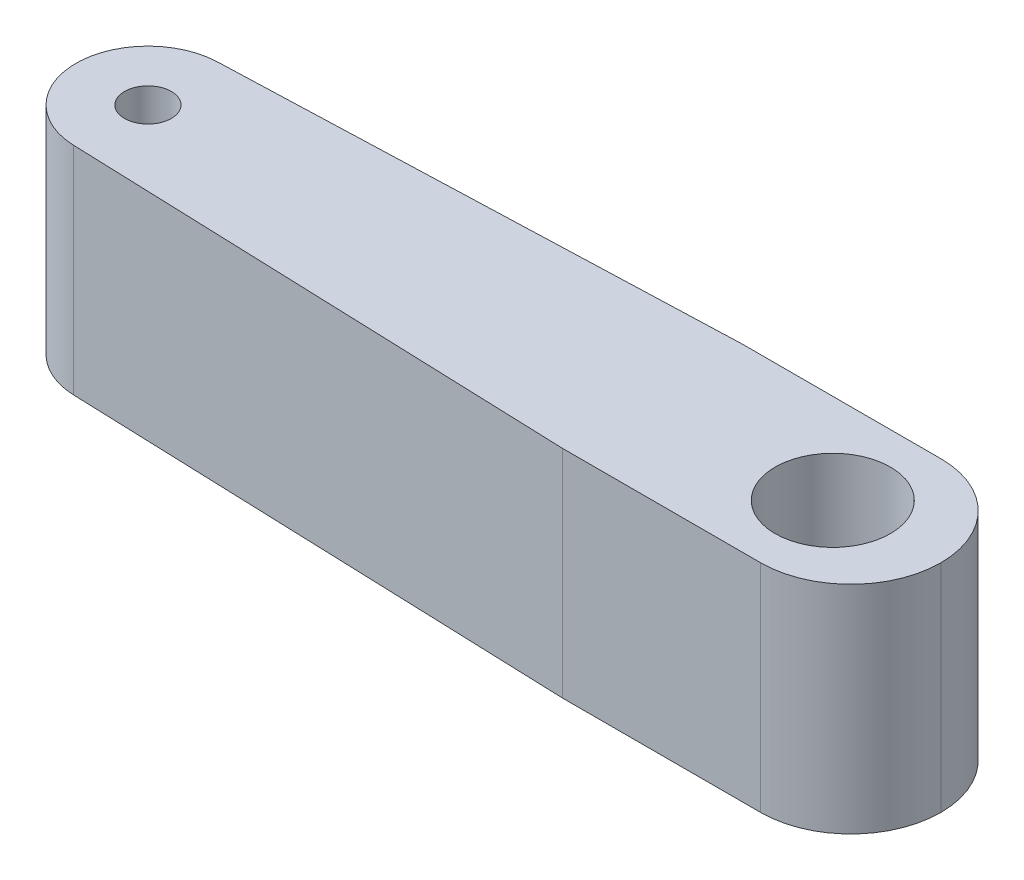
ISO-10303-21;
HEADER;
FILE_DESCRIPTION(('STEP AP214'),'2;1');
FILE_NAME('part.step','',(''),(''),'','','');
FILE_SCHEMA(('AUTOMOTIVE_DESIGN { 1 0 10303 214 1 1 1 1 }'));
ENDSEC;
DATA;
#1=APPLICATION_CONTEXT('core data for automotive mechanical design processes');
#2=APPLICATION_PROTOCOL_DEFINITION('international standard','automotive_design',2000,#1);
#3=PRODUCT_CONTEXT('',#1,'mechanical');
#4=PRODUCT('Part','Part','',(#3));
#5=PRODUCT_RELATED_PRODUCT_CATEGORY('part','',(#4));
#6=PRODUCT_DEFINITION_FORMATION('','',#4);
#7=PRODUCT_DEFINITION_CONTEXT('part definition',#1,'design');
#8=PRODUCT_DEFINITION('design','',#6,#7);
#9=PRODUCT_DEFINITION_SHAPE('','',#8);
#10=(LENGTH_UNIT() NAMED_UNIT(*) SI_UNIT(.MILLI.,.METRE.));
#11=(NAMED_UNIT(*) PLANE_ANGLE_UNIT() SI_UNIT($,.RADIAN.));
#12=(NAMED_UNIT(*) SI_UNIT($,.STERADIAN.) SOLID_ANGLE_UNIT());
#13=UNCERTAINTY_MEASURE_WITH_UNIT(LENGTH_MEASURE(1.E-05),#10,'distance_accuracy_value','');
#14=(GEOMETRIC_REPRESENTATION_CONTEXT(3) GLOBAL_UNCERTAINTY_ASSIGNED_CONTEXT((#13)) GLOBAL_UNIT_ASSIGNED_CONTEXT((#10,
#11,#12)) REPRESENTATION_CONTEXT('',''));
#15=CARTESIAN_POINT('',(0.,0.,0.));
#16=DIRECTION('',(0.,0.,1.));
#17=DIRECTION('',(1.,0.,0.));
#18=AXIS2_PLACEMENT_3D('',#15,#16,#17);
#19=CARTESIAN_POINT('',(-12.5,6.,-2.5));
#20=DIRECTION('',(0.,0.,1.));
#21=DIRECTION('',(1.,0.,0.));
#22=AXIS2_PLACEMENT_3D('',#19,#20,#21);
#23=PLANE('',#22);
#24=DIRECTION('',(0.,1.,0.));
#25=VECTOR('',#24,1.);
#26=CARTESIAN_POINT('',(4.5,-1.,-2.5));
#27=LINE('',#26,#25);
#28=CARTESIAN_POINT('',(4.49999999999763,0.,-2.49999999999996));
#29=VERTEX_POINT('',#28);
#30=CARTESIAN_POINT('',(4.5,6.,-2.5));
#31=VERTEX_POINT('',#30);
#32=EDGE_CURVE('E54',#29,#31,#27,.T.);
#33=ORIENTED_EDGE('',*,*,#32,.T.);
#34=DIRECTION('',(-1.,0.,0.));
#35=VECTOR('',#34,1.);
#36=CARTESIAN_POINT('',(-12.5,6.,-2.5));
#37=LINE('',#36,#35);
#38=CARTESIAN_POINT('',(10.,6.,-2.5));
#39=VERTEX_POINT('',#38);
#40=EDGE_CURVE('E117',#39,#31,#37,.T.);
#41=ORIENTED_EDGE('',*,*,#40,.F.);
#42=DIRECTION('',(0.,-1.,0.));
#43=VECTOR('',#42,1.);
#44=CARTESIAN_POINT('',(10.,6.,-2.5));
#45=LINE('',#44,#43);
#46=CARTESIAN_POINT('',(10.,0.,-2.5));
#47=VERTEX_POINT('',#46);
#48=EDGE_CURVE('E157',#39,#47,#45,.T.);
#49=ORIENTED_EDGE('',*,*,#48,.T.);
#50=DIRECTION('',(-1.,0.,0.));
#51=VECTOR('',#50,1.);
#52=CARTESIAN_POINT('',(-12.5,0.,-2.5));
#53=LINE('',#52,#51);
#54=EDGE_CURVE('E138',#47,#29,#53,.T.);
#55=ORIENTED_EDGE('',*,*,#54,.T.);
#56=EDGE_LOOP('',(#33,#41,#49,#55));
#57=FACE_BOUND('',#56,.T.);
#58=ADVANCED_FACE('F39',(#57),#23,.F.);
#59=CARTESIAN_POINT('',(-12.5,6.,2.5));
#60=DIRECTION('',(0.,0.,-1.));
#61=DIRECTION('',(-1.,0.,0.));
#62=AXIS2_PLACEMENT_3D('',#59,#60,#61);
#63=PLANE('',#62);
#64=DIRECTION('',(1.,0.,0.));
#65=VECTOR('',#64,1.);
#66=CARTESIAN_POINT('',(-12.5,6.,2.5));
#67=LINE('',#66,#65);
#68=CARTESIAN_POINT('',(4.5,6.,2.5));
#69=VERTEX_POINT('',#68);
#70=CARTESIAN_POINT('',(10.,6.,2.5));
#71=VERTEX_POINT('',#70);
#72=EDGE_CURVE('E134',#69,#71,#67,.T.);
#73=ORIENTED_EDGE('',*,*,#72,.F.);
#74=DIRECTION('',(0.,1.,0.));
#75=VECTOR('',#74,1.);
#76=CARTESIAN_POINT('',(4.5,-1.,2.5));
#77=LINE('',#76,#75);
#78=CARTESIAN_POINT('',(4.5,0.,2.5));
#79=VERTEX_POINT('',#78);
#80=EDGE_CURVE('E123',#79,#69,#77,.T.);
#81=ORIENTED_EDGE('',*,*,#80,.F.);
#82=DIRECTION('',(1.,0.,0.));
#83=VECTOR('',#82,1.);
#84=CARTESIAN_POINT('',(-12.5,0.,2.5));
#85=LINE('',#84,#83);
#86=CARTESIAN_POINT('',(10.,0.,2.5));
#87=VERTEX_POINT('',#86);
#88=EDGE_CURVE('E135',#79,#87,#85,.T.);
#89=ORIENTED_EDGE('',*,*,#88,.T.);
#90=DIRECTION('',(0.,-1.,0.));
#91=VECTOR('',#90,1.);
#92=CARTESIAN_POINT('',(10.,6.,2.5));
#93=LINE('',#92,#91);
#94=EDGE_CURVE('E151',#87,#71,#93,.F.);
#95=ORIENTED_EDGE('',*,*,#94,.T.);
#96=EDGE_LOOP('',(#73,#81,#89,#95));
#97=FACE_BOUND('',#96,.T.);
#98=ADVANCED_FACE('F171',(#97),#63,.F.);
#99=CARTESIAN_POINT('',(0.,6.,0.));
#100=DIRECTION('',(0.,1.,0.));
#101=DIRECTION('',(0.,0.,1.));
#102=AXIS2_PLACEMENT_3D('',#99,#100,#101);
#103=PLANE('',#102);
#104=DIRECTION('',(-0.999366080418273,0.,-0.0356010857898856));
#105=VECTOR('',#104,1.);
#106=CARTESIAN_POINT('',(-0.083242826018797,6.,2.33672807768633));
#107=LINE('',#106,#105);
#108=CARTESIAN_POINT('',(-9.57120217157932,6.,1.99873216082384));
#109=VERTEX_POINT('',#108);
#110=EDGE_CURVE('E105',#69,#109,#107,.T.);
#111=ORIENTED_EDGE('',*,*,#110,.F.);
#112=ORIENTED_EDGE('',*,*,#72,.T.);
#113=CARTESIAN_POINT('',(10.,6.,0.));
#114=DIRECTION('',(0.,1.,0.));
#115=DIRECTION('',(0.,0.,1.));
#116=AXIS2_PLACEMENT_3D('',#113,#114,#115);
#117=CIRCLE('',#116,2.5);
#118=CARTESIAN_POINT('',(12.5,6.,0.));
#119=VERTEX_POINT('',#118);
#120=EDGE_CURVE('E155',#71,#119,#117,.T.);
#121=ORIENTED_EDGE('',*,*,#120,.T.);
#122=CARTESIAN_POINT('',(10.,6.,0.));
#123=DIRECTION('',(0.,1.,0.));
#124=DIRECTION('',(0.,0.,1.));
#125=AXIS2_PLACEMENT_3D('',#122,#123,#124);
#126=CIRCLE('',#125,2.5);
#127=EDGE_CURVE('E62',#119,#39,#126,.T.);
#128=ORIENTED_EDGE('',*,*,#127,.T.);
#129=ORIENTED_EDGE('',*,*,#40,.T.);
#130=DIRECTION('',(-0.999366080418273,0.,0.0356010857898856));
#131=VECTOR('',#130,1.);
#132=CARTESIAN_POINT('',(-0.0832428260187969,6.,-2.33672807768633));
#133=LINE('',#132,#131);
#134=CARTESIAN_POINT('',(-9.57120217157932,6.,-1.99873216082384));
#135=VERTEX_POINT('',#134);
#136=EDGE_CURVE('E101',#31,#135,#133,.T.);
#137=ORIENTED_EDGE('',*,*,#136,.T.);
#138=CARTESIAN_POINT('',(-9.5,6.,0.));
#139=DIRECTION('',(0.,1.,0.));
#140=DIRECTION('',(0.,0.,1.));
#141=AXIS2_PLACEMENT_3D('',#138,#139,#140);
#142=CIRCLE('',#141,2.);
#143=EDGE_CURVE('E108',#135,#109,#142,.T.);
#144=ORIENTED_EDGE('',*,*,#143,.T.);
#145=EDGE_LOOP('',(#111,#112,#121,#128,#129,#137,#144));
#146=FACE_BOUND('',#145,.T.);
#147=CARTESIAN_POINT('',(9.5,6.,0.));
#148=DIRECTION('',(0.,1.,0.));
#149=DIRECTION('',(0.,0.,1.));
#150=AXIS2_PLACEMENT_3D('',#147,#148,#149);
#151=CIRCLE('',#150,1.6);
#152=CARTESIAN_POINT('',(9.5,6.,1.6));
#153=VERTEX_POINT('',#152);
#154=EDGE_CURVE('E126',#153,#153,#151,.T.);
#155=ORIENTED_EDGE('',*,*,#154,.F.);
#156=EDGE_LOOP('',(#155));
#157=FACE_BOUND('',#156,.T.);
#158=CARTESIAN_POINT('',(-9.5,6.,0.));
#159=DIRECTION('',(0.,1.,0.));
#160=DIRECTION('',(0.,0.,1.));
#161=AXIS2_PLACEMENT_3D('',#158,#159,#160);
#162=CIRCLE('',#161,0.649999999999999);
#163=CARTESIAN_POINT('',(-9.5,6.,0.649999999999999));
#164=VERTEX_POINT('',#163);
#165=EDGE_CURVE('E130',#164,#164,#162,.T.);
#166=ORIENTED_EDGE('',*,*,#165,.F.);
#167=EDGE_LOOP('',(#166));
#168=FACE_BOUND('',#167,.T.);
#169=ADVANCED_FACE('F115',(#146,#157,#168),#103,.T.);
#170=CARTESIAN_POINT('',(0.,0.,0.));
#171=DIRECTION('',(0.,1.,0.));
#172=DIRECTION('',(0.,0.,1.));
#173=AXIS2_PLACEMENT_3D('',#170,#171,#172);
#174=PLANE('',#173);
#175=CARTESIAN_POINT('',(9.5,0.,0.));
#176=DIRECTION('',(0.,1.,0.));
#177=DIRECTION('',(0.,0.,1.));
#178=AXIS2_PLACEMENT_3D('',#175,#176,#177);
#179=CIRCLE('',#178,1.6);
#180=CARTESIAN_POINT('',(9.5,0.,1.6));
#181=VERTEX_POINT('',#180);
#182=EDGE_CURVE('E141',#181,#181,#179,.T.);
#183=ORIENTED_EDGE('',*,*,#182,.T.);
#184=EDGE_LOOP('',(#183));
#185=FACE_BOUND('',#184,.T.);
#186=CARTESIAN_POINT('',(-9.5,0.,0.));
#187=DIRECTION('',(0.,1.,0.));
#188=DIRECTION('',(0.,0.,1.));
#189=AXIS2_PLACEMENT_3D('',#186,#187,#188);
#190=CIRCLE('',#189,0.649999999999999);
#191=CARTESIAN_POINT('',(-9.5,0.,0.649999999999999));
#192=VERTEX_POINT('',#191);
#193=EDGE_CURVE('E129',#192,#192,#190,.T.);
#194=ORIENTED_EDGE('',*,*,#193,.T.);
#195=EDGE_LOOP('',(#194));
#196=FACE_BOUND('',#195,.T.);
#197=ORIENTED_EDGE('',*,*,#88,.F.);
#198=DIRECTION('',(-0.999366080418273,0.,-0.0356010857898856));
#199=VECTOR('',#198,1.);
#200=CARTESIAN_POINT('',(-0.083242826018797,0.,2.33672807768633));
#201=LINE('',#200,#199);
#202=CARTESIAN_POINT('',(-9.57120217157932,0.,1.99873216082384));
#203=VERTEX_POINT('',#202);
#204=EDGE_CURVE('E11',#79,#203,#201,.T.);
#205=ORIENTED_EDGE('',*,*,#204,.T.);
#206=CARTESIAN_POINT('',(-9.5,0.,0.));
#207=DIRECTION('',(0.,1.,0.));
#208=DIRECTION('',(0.,0.,1.));
#209=AXIS2_PLACEMENT_3D('',#206,#207,#208);
#210=CIRCLE('',#209,2.);
#211=CARTESIAN_POINT('',(-9.57120217157932,0.,-1.99873216082384));
#212=VERTEX_POINT('',#211);
#213=EDGE_CURVE('E47',#212,#203,#210,.T.);
#214=ORIENTED_EDGE('',*,*,#213,.F.);
#215=DIRECTION('',(-0.999366080418273,0.,0.0356010857898856));
#216=VECTOR('',#215,1.);
#217=CARTESIAN_POINT('',(-0.0832428260187969,0.,-2.33672807768633));
#218=LINE('',#217,#216);
#219=EDGE_CURVE('E102',#29,#212,#218,.T.);
#220=ORIENTED_EDGE('',*,*,#219,.F.);
#221=ORIENTED_EDGE('',*,*,#54,.F.);
#222=CARTESIAN_POINT('',(10.,0.,0.));
#223=DIRECTION('',(0.,1.,0.));
#224=DIRECTION('',(0.,0.,1.));
#225=AXIS2_PLACEMENT_3D('',#222,#223,#224);
#226=CIRCLE('',#225,2.5);
#227=CARTESIAN_POINT('',(12.5,0.,0.));
#228=VERTEX_POINT('',#227);
#229=EDGE_CURVE('E137',#47,#228,#226,.F.);
#230=ORIENTED_EDGE('',*,*,#229,.T.);
#231=CARTESIAN_POINT('',(10.,0.,0.));
#232=DIRECTION('',(0.,1.,0.));
#233=DIRECTION('',(0.,0.,1.));
#234=AXIS2_PLACEMENT_3D('',#231,#232,#233);
#235=CIRCLE('',#234,2.5);
#236=EDGE_CURVE('E148',#228,#87,#235,.F.);
#237=ORIENTED_EDGE('',*,*,#236,.T.);
#238=EDGE_LOOP('',(#197,#205,#214,#220,#221,#230,#237));
#239=FACE_BOUND('',#238,.T.);
#240=ADVANCED_FACE('F166',(#185,#196,#239),#174,.F.);
#241=CARTESIAN_POINT('',(-9.5,-4.,0.));
#242=DIRECTION('',(0.,1.,0.));
#243=DIRECTION('',(0.,0.,1.));
#244=AXIS2_PLACEMENT_3D('',#241,#242,#243);
#245=CYLINDRICAL_SURFACE('',#244,0.649999999999999);
#246=ORIENTED_EDGE('',*,*,#165,.T.);
#247=EDGE_LOOP('',(#246));
#248=FACE_BOUND('',#247,.T.);
#249=ORIENTED_EDGE('',*,*,#193,.F.);
#250=EDGE_LOOP('',(#249));
#251=FACE_BOUND('',#250,.T.);
#252=ADVANCED_FACE('F198',(#248,#251),#245,.F.);
#253=CARTESIAN_POINT('',(9.5,-4.,0.));
#254=DIRECTION('',(0.,1.,0.));
#255=DIRECTION('',(0.,0.,1.));
#256=AXIS2_PLACEMENT_3D('',#253,#254,#255);
#257=CYLINDRICAL_SURFACE('',#256,1.6);
#258=ORIENTED_EDGE('',*,*,#154,.T.);
#259=EDGE_LOOP('',(#258));
#260=FACE_BOUND('',#259,.T.);
#261=ORIENTED_EDGE('',*,*,#182,.F.);
#262=EDGE_LOOP('',(#261));
#263=FACE_BOUND('',#262,.T.);
#264=ADVANCED_FACE('F194',(#260,#263),#257,.F.);
#265=CARTESIAN_POINT('',(10.,6.,0.));
#266=DIRECTION('',(0.,-1.,0.));
#267=DIRECTION('',(0.,0.,-1.));
#268=AXIS2_PLACEMENT_3D('',#265,#266,#267);
#269=CYLINDRICAL_SURFACE('',#268,2.5);
#270=ORIENTED_EDGE('',*,*,#48,.F.);
#271=ORIENTED_EDGE('',*,*,#127,.F.);
#272=DIRECTION('',(0.,-1.,0.));
#273=VECTOR('',#272,1.);
#274=CARTESIAN_POINT('',(12.5,6.,0.));
#275=LINE('',#274,#273);
#276=EDGE_CURVE('E122',#228,#119,#275,.F.);
#277=ORIENTED_EDGE('',*,*,#276,.F.);
#278=ORIENTED_EDGE('',*,*,#229,.F.);
#279=EDGE_LOOP('',(#270,#271,#277,#278));
#280=FACE_BOUND('',#279,.T.);
#281=ADVANCED_FACE('F41',(#280),#269,.T.);
#282=CARTESIAN_POINT('',(10.,6.,0.));
#283=DIRECTION('',(0.,-1.,0.));
#284=DIRECTION('',(0.,0.,-1.));
#285=AXIS2_PLACEMENT_3D('',#282,#283,#284);
#286=CYLINDRICAL_SURFACE('',#285,2.5);
#287=ORIENTED_EDGE('',*,*,#120,.F.);
#288=ORIENTED_EDGE('',*,*,#94,.F.);
#289=ORIENTED_EDGE('',*,*,#236,.F.);
#290=ORIENTED_EDGE('',*,*,#276,.T.);
#291=EDGE_LOOP('',(#287,#288,#289,#290));
#292=FACE_BOUND('',#291,.T.);
#293=ADVANCED_FACE('F174',(#292),#286,.T.);
#294=CARTESIAN_POINT('',(-9.5,-1.,0.));
#295=DIRECTION('',(0.,1.,0.));
#296=DIRECTION('',(0.,0.,1.));
#297=AXIS2_PLACEMENT_3D('',#294,#295,#296);
#298=CYLINDRICAL_SURFACE('',#297,2.);
#299=ORIENTED_EDGE('',*,*,#213,.T.);
#300=DIRECTION('',(0.,1.,0.));
#301=VECTOR('',#300,1.);
#302=CARTESIAN_POINT('',(-9.57120217157932,-1.,1.99873216082384));
#303=LINE('',#302,#301);
#304=EDGE_CURVE('E111',#203,#109,#303,.T.);
#305=ORIENTED_EDGE('',*,*,#304,.T.);
#306=ORIENTED_EDGE('',*,*,#143,.F.);
#307=DIRECTION('',(0.,1.,0.));
#308=VECTOR('',#307,1.);
#309=CARTESIAN_POINT('',(-9.57120217157932,-1.,-1.99873216082384));
#310=LINE('',#309,#308);
#311=EDGE_CURVE('E97',#212,#135,#310,.T.);
#312=ORIENTED_EDGE('',*,*,#311,.F.);
#313=EDGE_LOOP('',(#299,#305,#306,#312));
#314=FACE_BOUND('',#313,.T.);
#315=ADVANCED_FACE('F109',(#314),#298,.T.);
#316=CARTESIAN_POINT('',(-0.083242826018797,-1.,2.33672807768633));
#317=DIRECTION('',(0.0356010857898856,0.,-0.999366080418273));
#318=DIRECTION('',(-0.999366080418273,0.,-0.0356010857898856));
#319=AXIS2_PLACEMENT_3D('',#316,#317,#318);
#320=PLANE('',#319);
#321=ORIENTED_EDGE('',*,*,#80,.T.);
#322=ORIENTED_EDGE('',*,*,#110,.T.);
#323=ORIENTED_EDGE('',*,*,#304,.F.);
#324=ORIENTED_EDGE('',*,*,#204,.F.);
#325=EDGE_LOOP('',(#321,#322,#323,#324));
#326=FACE_BOUND('',#325,.T.);
#327=ADVANCED_FACE('F163',(#326),#320,.F.);
#328=CARTESIAN_POINT('',(-0.0832428260187969,-1.,-2.33672807768633));
#329=DIRECTION('',(-0.0356010857898856,0.,-0.999366080418273));
#330=DIRECTION('',(-0.999366080418273,0.,0.0356010857898856));
#331=AXIS2_PLACEMENT_3D('',#328,#329,#330);
#332=PLANE('',#331);
#333=ORIENTED_EDGE('',*,*,#219,.T.);
#334=ORIENTED_EDGE('',*,*,#311,.T.);
#335=ORIENTED_EDGE('',*,*,#136,.F.);
#336=ORIENTED_EDGE('',*,*,#32,.F.);
#337=EDGE_LOOP('',(#333,#334,#335,#336));
#338=FACE_BOUND('',#337,.T.);
#339=ADVANCED_FACE('F99',(#338),#332,.T.);
#340=CLOSED_SHELL('',(#58,#98,#169,#240,#252,#264,#281,#293,#315,#327,#339));
#341=MANIFOLD_SOLID_BREP('B2',#340);
#342=ADVANCED_BREP_SHAPE_REPRESENTATION('',(#18,#341),#14);
#343=SHAPE_DEFINITION_REPRESENTATION(#9,#342);
ENDSEC;
END-ISO-10303-21;
